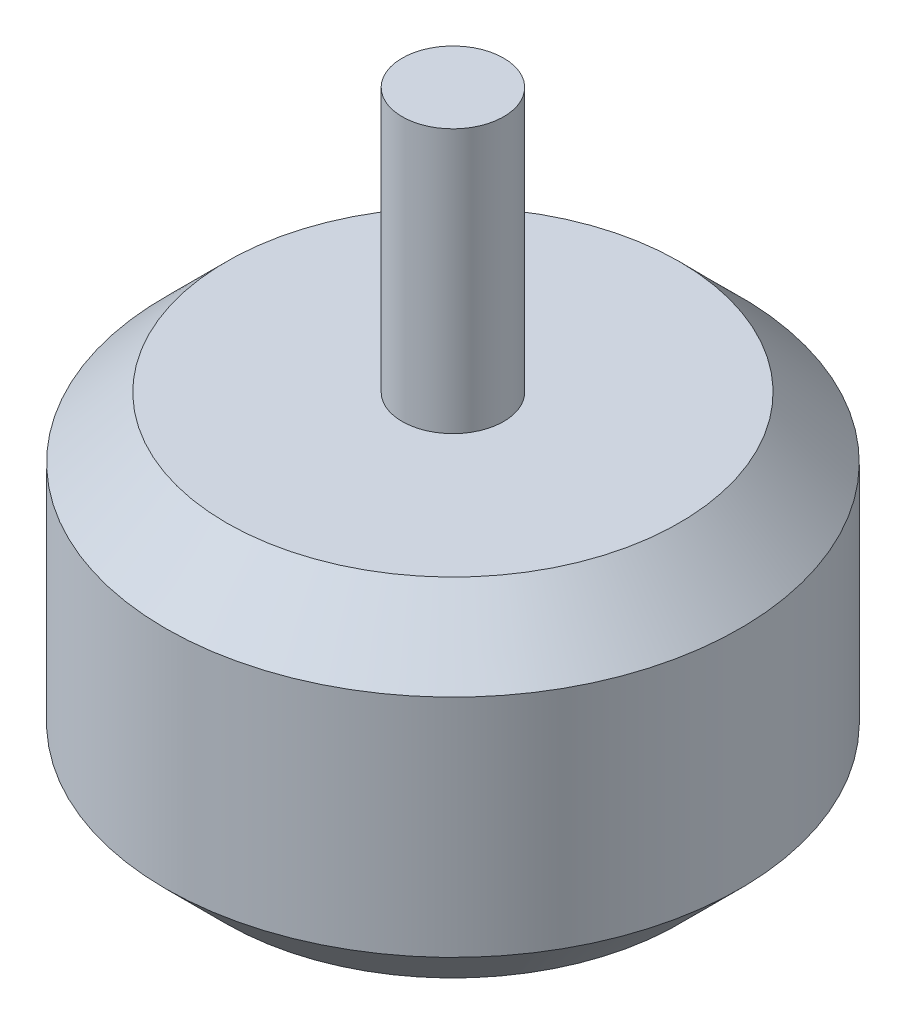
ISO-10303-21;
HEADER;
FILE_DESCRIPTION(('STEP AP214'),'2;1');
FILE_NAME('part.step','',(''),(''),'','','');
FILE_SCHEMA(('AUTOMOTIVE_DESIGN { 1 0 10303 214 1 1 1 1 }'));
ENDSEC;
DATA;
#1=APPLICATION_CONTEXT('core data for automotive mechanical design processes');
#2=APPLICATION_PROTOCOL_DEFINITION('international standard','automotive_design',2000,#1);
#3=PRODUCT_CONTEXT('',#1,'mechanical');
#4=PRODUCT('Part','Part','',(#3));
#5=PRODUCT_RELATED_PRODUCT_CATEGORY('part','',(#4));
#6=PRODUCT_DEFINITION_FORMATION('','',#4);
#7=PRODUCT_DEFINITION_CONTEXT('part definition',#1,'design');
#8=PRODUCT_DEFINITION('design','',#6,#7);
#9=PRODUCT_DEFINITION_SHAPE('','',#8);
#10=(LENGTH_UNIT() NAMED_UNIT(*) SI_UNIT(.MILLI.,.METRE.));
#11=(NAMED_UNIT(*) PLANE_ANGLE_UNIT() SI_UNIT($,.RADIAN.));
#12=(NAMED_UNIT(*) SI_UNIT($,.STERADIAN.) SOLID_ANGLE_UNIT());
#13=UNCERTAINTY_MEASURE_WITH_UNIT(LENGTH_MEASURE(1.E-05),#10,'distance_accuracy_value','');
#14=(GEOMETRIC_REPRESENTATION_CONTEXT(3) GLOBAL_UNCERTAINTY_ASSIGNED_CONTEXT((#13)) GLOBAL_UNIT_ASSIGNED_CONTEXT((#10,
#11,#12)) REPRESENTATION_CONTEXT('',''));
#15=CARTESIAN_POINT('',(0.,0.,0.));
#16=DIRECTION('',(0.,0.,1.));
#17=DIRECTION('',(1.,0.,0.));
#18=AXIS2_PLACEMENT_3D('',#15,#16,#17);
#19=CARTESIAN_POINT('',(0.,17.1,0.));
#20=DIRECTION('',(0.,-1.,0.));
#21=DIRECTION('',(0.,0.,-1.));
#22=AXIS2_PLACEMENT_3D('',#19,#20,#21);
#23=CYLINDRICAL_SURFACE('',#22,14.15);
#24=CARTESIAN_POINT('',(0.,3.00000000000001,0.));
#25=DIRECTION('',(0.,1.,0.));
#26=DIRECTION('',(0.,0.,1.));
#27=AXIS2_PLACEMENT_3D('',#24,#25,#26);
#28=CIRCLE('',#27,14.15);
#29=CARTESIAN_POINT('',(0.,3.00000000000001,14.15));
#30=VERTEX_POINT('',#29);
#31=EDGE_CURVE('E54',#30,#30,#28,.T.);
#32=ORIENTED_EDGE('',*,*,#31,.T.);
#33=EDGE_LOOP('',(#32));
#34=FACE_BOUND('',#33,.T.);
#35=CARTESIAN_POINT('',(0.,14.1,0.));
#36=DIRECTION('',(0.,1.,0.));
#37=DIRECTION('',(0.,0.,1.));
#38=AXIS2_PLACEMENT_3D('',#35,#36,#37);
#39=CIRCLE('',#38,14.15);
#40=CARTESIAN_POINT('',(0.,14.1,14.15));
#41=VERTEX_POINT('',#40);
#42=EDGE_CURVE('E59',#41,#41,#39,.F.);
#43=ORIENTED_EDGE('',*,*,#42,.T.);
#44=EDGE_LOOP('',(#43));
#45=FACE_BOUND('',#44,.T.);
#46=ADVANCED_FACE('F38',(#34,#45),#23,.T.);
#47=CARTESIAN_POINT('',(0.,17.1,0.));
#48=DIRECTION('',(0.,1.,0.));
#49=DIRECTION('',(0.,0.,1.));
#50=AXIS2_PLACEMENT_3D('',#47,#48,#49);
#51=PLANE('',#50);
#52=CARTESIAN_POINT('',(0.,17.1,0.));
#53=DIRECTION('',(0.,1.,0.));
#54=DIRECTION('',(0.,0.,1.));
#55=AXIS2_PLACEMENT_3D('',#52,#53,#54);
#56=CIRCLE('',#55,11.15);
#57=CARTESIAN_POINT('',(0.,17.1,11.15));
#58=VERTEX_POINT('',#57);
#59=EDGE_CURVE('E46',#58,#58,#56,.T.);
#60=ORIENTED_EDGE('',*,*,#59,.T.);
#61=EDGE_LOOP('',(#60));
#62=FACE_BOUND('',#61,.T.);
#63=CARTESIAN_POINT('',(0.,17.1,0.));
#64=DIRECTION('',(0.,1.,0.));
#65=DIRECTION('',(0.,0.,1.));
#66=AXIS2_PLACEMENT_3D('',#63,#64,#65);
#67=CIRCLE('',#66,2.5);
#68=CARTESIAN_POINT('',(0.,17.1,-2.5));
#69=VERTEX_POINT('',#68);
#70=EDGE_CURVE('E62',#69,#69,#67,.T.);
#71=ORIENTED_EDGE('',*,*,#70,.F.);
#72=EDGE_LOOP('',(#71));
#73=FACE_BOUND('',#72,.T.);
#74=ADVANCED_FACE('F111',(#62,#73),#51,.T.);
#75=CARTESIAN_POINT('',(0.,0.,0.));
#76=DIRECTION('',(0.,1.,0.));
#77=DIRECTION('',(0.,0.,1.));
#78=AXIS2_PLACEMENT_3D('',#75,#76,#77);
#79=PLANE('',#78);
#80=CARTESIAN_POINT('',(0.,0.,0.));
#81=DIRECTION('',(0.,1.,0.));
#82=DIRECTION('',(0.,0.,1.));
#83=AXIS2_PLACEMENT_3D('',#80,#81,#82);
#84=CIRCLE('',#83,2.5);
#85=CARTESIAN_POINT('',(0.,0.,2.5));
#86=VERTEX_POINT('',#85);
#87=EDGE_CURVE('E10',#86,#86,#84,.F.);
#88=ORIENTED_EDGE('',*,*,#87,.F.);
#89=EDGE_LOOP('',(#88));
#90=FACE_BOUND('',#89,.T.);
#91=CARTESIAN_POINT('',(-8.00000000000001,0.,0.));
#92=DIRECTION('',(0.,-1.,0.));
#93=DIRECTION('',(0.,0.,-1.));
#94=AXIS2_PLACEMENT_3D('',#91,#92,#93);
#95=CIRCLE('',#94,1.5);
#96=CARTESIAN_POINT('',(-8.00000000000001,0.,-1.5));
#97=VERTEX_POINT('',#96);
#98=EDGE_CURVE('E88',#97,#97,#95,.T.);
#99=ORIENTED_EDGE('',*,*,#98,.F.);
#100=EDGE_LOOP('',(#99));
#101=FACE_BOUND('',#100,.T.);
#102=CARTESIAN_POINT('',(0.,0.,8.00000000000001));
#103=DIRECTION('',(0.,-1.,0.));
#104=DIRECTION('',(0.,0.,-1.));
#105=AXIS2_PLACEMENT_3D('',#102,#103,#104);
#106=CIRCLE('',#105,1.5);
#107=CARTESIAN_POINT('',(0.,0.,6.50000000000001));
#108=VERTEX_POINT('',#107);
#109=EDGE_CURVE('E82',#108,#108,#106,.T.);
#110=ORIENTED_EDGE('',*,*,#109,.F.);
#111=EDGE_LOOP('',(#110));
#112=FACE_BOUND('',#111,.T.);
#113=CARTESIAN_POINT('',(8.00000000000001,0.,0.));
#114=DIRECTION('',(0.,-1.,0.));
#115=DIRECTION('',(0.,0.,1.));
#116=AXIS2_PLACEMENT_3D('',#113,#114,#115);
#117=CIRCLE('',#116,1.5);
#118=CARTESIAN_POINT('',(8.00000000000001,0.,1.5));
#119=VERTEX_POINT('',#118);
#120=EDGE_CURVE('E76',#119,#119,#117,.T.);
#121=ORIENTED_EDGE('',*,*,#120,.F.);
#122=EDGE_LOOP('',(#121));
#123=FACE_BOUND('',#122,.T.);
#124=CARTESIAN_POINT('',(0.,0.,-8.00000000000001));
#125=DIRECTION('',(0.,-1.,0.));
#126=DIRECTION('',(0.,0.,1.));
#127=AXIS2_PLACEMENT_3D('',#124,#125,#126);
#128=CIRCLE('',#127,1.5);
#129=CARTESIAN_POINT('',(0.,0.,-6.50000000000001));
#130=VERTEX_POINT('',#129);
#131=EDGE_CURVE('E69',#130,#130,#128,.T.);
#132=ORIENTED_EDGE('',*,*,#131,.F.);
#133=EDGE_LOOP('',(#132));
#134=FACE_BOUND('',#133,.T.);
#135=CARTESIAN_POINT('',(0.,0.,0.));
#136=DIRECTION('',(0.,1.,0.));
#137=DIRECTION('',(0.,0.,1.));
#138=AXIS2_PLACEMENT_3D('',#135,#136,#137);
#139=CIRCLE('',#138,11.15);
#140=CARTESIAN_POINT('',(0.,0.,11.15));
#141=VERTEX_POINT('',#140);
#142=EDGE_CURVE('E50',#141,#141,#139,.F.);
#143=ORIENTED_EDGE('',*,*,#142,.T.);
#144=EDGE_LOOP('',(#143));
#145=FACE_BOUND('',#144,.T.);
#146=ADVANCED_FACE('F117',(#90,#101,#112,#123,#134,#145),#79,.F.);
#147=CARTESIAN_POINT('',(0.,30.1,0.));
#148=DIRECTION('',(0.,-1.,0.));
#149=DIRECTION('',(0.,0.,-1.));
#150=AXIS2_PLACEMENT_3D('',#147,#148,#149);
#151=CYLINDRICAL_SURFACE('',#150,2.5);
#152=CARTESIAN_POINT('',(0.,30.1,0.));
#153=DIRECTION('',(0.,1.,0.));
#154=DIRECTION('',(0.,0.,1.));
#155=AXIS2_PLACEMENT_3D('',#152,#153,#154);
#156=CIRCLE('',#155,2.5);
#157=CARTESIAN_POINT('',(0.,30.1,-2.5));
#158=VERTEX_POINT('',#157);
#159=EDGE_CURVE('E65',#158,#158,#156,.T.);
#160=CARTESIAN_POINT('',(0.,30.1,-2.5));
#161=CARTESIAN_POINT('',(0.,29.9645833333333,-2.5));
#162=CARTESIAN_POINT('',(0.,29.8291666666667,-2.5));
#163=CARTESIAN_POINT('',(0.,29.5583333333333,-2.5));
#164=CARTESIAN_POINT('',(0.,29.4229166666667,-2.5));
#165=CARTESIAN_POINT('',(0.,29.1520833333333,-2.5));
#166=CARTESIAN_POINT('',(0.,29.0166666666667,-2.5));
#167=CARTESIAN_POINT('',(0.,28.7458333333333,-2.5));
#168=CARTESIAN_POINT('',(0.,28.6104166666667,-2.5));
#169=CARTESIAN_POINT('',(0.,28.3395833333333,-2.5));
#170=CARTESIAN_POINT('',(0.,28.2041666666667,-2.5));
#171=CARTESIAN_POINT('',(0.,27.9333333333333,-2.5));
#172=CARTESIAN_POINT('',(0.,27.7979166666667,-2.5));
#173=CARTESIAN_POINT('',(0.,27.5270833333333,-2.5));
#174=CARTESIAN_POINT('',(0.,27.3916666666667,-2.5));
#175=CARTESIAN_POINT('',(0.,27.1208333333333,-2.5));
#176=CARTESIAN_POINT('',(0.,26.9854166666667,-2.5));
#177=CARTESIAN_POINT('',(0.,26.7145833333333,-2.5));
#178=CARTESIAN_POINT('',(0.,26.5791666666667,-2.5));
#179=CARTESIAN_POINT('',(0.,26.3083333333333,-2.5));
#180=CARTESIAN_POINT('',(0.,26.1729166666667,-2.5));
#181=CARTESIAN_POINT('',(0.,25.9020833333333,-2.5));
#182=CARTESIAN_POINT('',(0.,25.7666666666667,-2.5));
#183=CARTESIAN_POINT('',(0.,25.4958333333333,-2.5));
#184=CARTESIAN_POINT('',(0.,25.3604166666667,-2.5));
#185=CARTESIAN_POINT('',(0.,25.0895833333333,-2.5));
#186=CARTESIAN_POINT('',(0.,24.9541666666667,-2.5));
#187=CARTESIAN_POINT('',(0.,24.6833333333333,-2.5));
#188=CARTESIAN_POINT('',(0.,24.5479166666667,-2.5));
#189=CARTESIAN_POINT('',(0.,24.2770833333333,-2.5));
#190=CARTESIAN_POINT('',(0.,24.1416666666667,-2.5));
#191=CARTESIAN_POINT('',(0.,23.8708333333333,-2.5));
#192=CARTESIAN_POINT('',(0.,23.7354166666667,-2.5));
#193=CARTESIAN_POINT('',(0.,23.4645833333333,-2.5));
#194=CARTESIAN_POINT('',(0.,23.3291666666667,-2.5));
#195=CARTESIAN_POINT('',(0.,23.0583333333333,-2.5));
#196=CARTESIAN_POINT('',(0.,22.9229166666667,-2.5));
#197=CARTESIAN_POINT('',(0.,22.6520833333333,-2.5));
#198=CARTESIAN_POINT('',(0.,22.5166666666667,-2.5));
#199=CARTESIAN_POINT('',(0.,22.2458333333333,-2.5));
#200=CARTESIAN_POINT('',(0.,22.1104166666667,-2.5));
#201=CARTESIAN_POINT('',(0.,21.8395833333333,-2.5));
#202=CARTESIAN_POINT('',(0.,21.7041666666667,-2.5));
#203=CARTESIAN_POINT('',(0.,21.4333333333333,-2.5));
#204=CARTESIAN_POINT('',(0.,21.2979166666667,-2.5));
#205=CARTESIAN_POINT('',(0.,21.0270833333333,-2.5));
#206=CARTESIAN_POINT('',(0.,20.8916666666667,-2.5));
#207=CARTESIAN_POINT('',(0.,20.6208333333333,-2.5));
#208=CARTESIAN_POINT('',(0.,20.4854166666667,-2.5));
#209=CARTESIAN_POINT('',(0.,20.2145833333333,-2.5));
#210=CARTESIAN_POINT('',(0.,20.0791666666667,-2.5));
#211=CARTESIAN_POINT('',(0.,19.8083333333333,-2.5));
#212=CARTESIAN_POINT('',(0.,19.6729166666667,-2.5));
#213=CARTESIAN_POINT('',(0.,19.4020833333333,-2.5));
#214=CARTESIAN_POINT('',(0.,19.2666666666667,-2.5));
#215=CARTESIAN_POINT('',(0.,18.9958333333333,-2.5));
#216=CARTESIAN_POINT('',(0.,18.8604166666667,-2.5));
#217=CARTESIAN_POINT('',(0.,18.5895833333333,-2.5));
#218=CARTESIAN_POINT('',(0.,18.4541666666667,-2.5));
#219=CARTESIAN_POINT('',(0.,18.1833333333333,-2.5));
#220=CARTESIAN_POINT('',(0.,18.0479166666667,-2.5));
#221=CARTESIAN_POINT('',(0.,17.7770833333333,-2.5));
#222=CARTESIAN_POINT('',(0.,17.6416666666667,-2.5));
#223=CARTESIAN_POINT('',(0.,17.3708333333333,-2.5));
#224=CARTESIAN_POINT('',(0.,17.2354166666667,-2.5));
#225=CARTESIAN_POINT('',(0.,17.1,-2.5));
#226=B_SPLINE_CURVE_WITH_KNOTS('',3,(#160,#161,#162,#163,#164,#165,#166,#167,#168,#169,#170,
#171,#172,#173,#174,#175,#176,#177,#178,#179,#180,#181,#182,#183,#184,#185,#186,#187,#188,#189,
#190,#191,#192,#193,#194,#195,#196,#197,#198,#199,#200,#201,#202,#203,#204,#205,#206,#207,#208,
#209,#210,#211,#212,#213,#214,#215,#216,#217,#218,#219,#220,#221,#222,#223,#224,#225),
.UNSPECIFIED.,.F.,.F.,(4,2,2,2,2,2,2,2,2,2,2,2,2,2,2,2,2,2,2,2,2,2,2,2,2,2,2,2,2,2,2,2,4),(0.,
0.406249999999997,0.812499999999997,1.21875,1.625,2.03125,2.4375,2.84375,3.25,3.65625,4.0625,
4.46875,4.875,5.28125,5.6875,6.09375,6.5,6.90625,7.3125,7.71875,8.125,8.53125,8.9375,9.34375,
9.75,10.15625,10.5625,10.96875,11.375,11.78125,12.1875,12.59375,13.),.UNSPECIFIED.);
#227=EDGE_CURVE('BSEAM134',#158,#69,#226,.T.);
#228=ORIENTED_EDGE('',*,*,#159,.F.);
#229=ORIENTED_EDGE('',*,*,#70,.T.);
#230=ORIENTED_EDGE('',*,*,#227,.T.);
#231=ORIENTED_EDGE('',*,*,#227,.F.);
#232=EDGE_LOOP('',(#228,#230,#229,#231));
#233=FACE_BOUND('',#232,.T.);
#234=ADVANCED_FACE('F134',(#233),#151,.T.);
#235=CARTESIAN_POINT('',(0.,30.1,0.));
#236=DIRECTION('',(0.,1.,0.));
#237=DIRECTION('',(0.,0.,1.));
#238=AXIS2_PLACEMENT_3D('',#235,#236,#237);
#239=PLANE('',#238);
#240=ORIENTED_EDGE('',*,*,#159,.T.);
#241=EDGE_LOOP('',(#240));
#242=FACE_BOUND('',#241,.T.);
#243=ADVANCED_FACE('F126',(#242),#239,.T.);
#244=CARTESIAN_POINT('',(0.,3.00000000000001,0.));
#245=DIRECTION('',(0.,1.,0.));
#246=DIRECTION('',(0.,0.,1.));
#247=AXIS2_PLACEMENT_3D('',#244,#245,#246);
#248=CONICAL_SURFACE('',#247,14.15,0.785398163397449);
#249=ORIENTED_EDGE('',*,*,#142,.F.);
#250=EDGE_LOOP('',(#249));
#251=FACE_BOUND('',#250,.T.);
#252=ORIENTED_EDGE('',*,*,#31,.F.);
#253=EDGE_LOOP('',(#252));
#254=FACE_BOUND('',#253,.T.);
#255=ADVANCED_FACE('F122',(#251,#254),#248,.T.);
#256=CARTESIAN_POINT('',(0.,17.1,0.));
#257=DIRECTION('',(0.,-1.,0.));
#258=DIRECTION('',(0.,0.,-1.));
#259=AXIS2_PLACEMENT_3D('',#256,#257,#258);
#260=CONICAL_SURFACE('',#259,11.15,0.785398163397447);
#261=ORIENTED_EDGE('',*,*,#42,.F.);
#262=EDGE_LOOP('',(#261));
#263=FACE_BOUND('',#262,.T.);
#264=ORIENTED_EDGE('',*,*,#59,.F.);
#265=EDGE_LOOP('',(#264));
#266=FACE_BOUND('',#265,.T.);
#267=ADVANCED_FACE('F41',(#263,#266),#260,.T.);
#268=CARTESIAN_POINT('',(0.,4.,-8.00000000000001));
#269=DIRECTION('',(0.,-1.,0.));
#270=DIRECTION('',(0.,0.,-1.));
#271=AXIS2_PLACEMENT_3D('',#268,#269,#270);
#272=CYLINDRICAL_SURFACE('',#271,1.5);
#273=CARTESIAN_POINT('',(0.,4.,-8.00000000000001));
#274=DIRECTION('',(0.,-1.,0.));
#275=DIRECTION('',(0.,0.,1.));
#276=AXIS2_PLACEMENT_3D('',#273,#274,#275);
#277=CIRCLE('',#276,1.5);
#278=CARTESIAN_POINT('',(0.,4.,-6.50000000000001));
#279=VERTEX_POINT('',#278);
#280=EDGE_CURVE('E72',#279,#279,#277,.T.);
#281=ORIENTED_EDGE('',*,*,#280,.F.);
#282=EDGE_LOOP('',(#281));
#283=FACE_BOUND('',#282,.T.);
#284=ORIENTED_EDGE('',*,*,#131,.T.);
#285=EDGE_LOOP('',(#284));
#286=FACE_BOUND('',#285,.T.);
#287=ADVANCED_FACE('F132',(#283,#286),#272,.F.);
#288=CARTESIAN_POINT('',(0.,4.,-8.00000000000001));
#289=DIRECTION('',(0.,1.,0.));
#290=DIRECTION('',(0.,0.,1.));
#291=AXIS2_PLACEMENT_3D('',#288,#289,#290);
#292=PLANE('',#291);
#293=ORIENTED_EDGE('',*,*,#280,.T.);
#294=EDGE_LOOP('',(#293));
#295=FACE_BOUND('',#294,.T.);
#296=ADVANCED_FACE('F158',(#295),#292,.F.);
#297=CARTESIAN_POINT('',(8.00000000000001,4.,0.));
#298=DIRECTION('',(0.,-1.,0.));
#299=DIRECTION('',(0.,0.,-1.));
#300=AXIS2_PLACEMENT_3D('',#297,#298,#299);
#301=CYLINDRICAL_SURFACE('',#300,1.5);
#302=CARTESIAN_POINT('',(8.00000000000001,4.,0.));
#303=DIRECTION('',(0.,-1.,0.));
#304=DIRECTION('',(0.,0.,1.));
#305=AXIS2_PLACEMENT_3D('',#302,#303,#304);
#306=CIRCLE('',#305,1.5);
#307=CARTESIAN_POINT('',(8.00000000000001,4.,1.5));
#308=VERTEX_POINT('',#307);
#309=EDGE_CURVE('E79',#308,#308,#306,.T.);
#310=ORIENTED_EDGE('',*,*,#309,.F.);
#311=EDGE_LOOP('',(#310));
#312=FACE_BOUND('',#311,.T.);
#313=ORIENTED_EDGE('',*,*,#120,.T.);
#314=EDGE_LOOP('',(#313));
#315=FACE_BOUND('',#314,.T.);
#316=ADVANCED_FACE('F164',(#312,#315),#301,.F.);
#317=CARTESIAN_POINT('',(8.00000000000001,4.,0.));
#318=DIRECTION('',(0.,1.,0.));
#319=DIRECTION('',(0.,0.,1.));
#320=AXIS2_PLACEMENT_3D('',#317,#318,#319);
#321=PLANE('',#320);
#322=ORIENTED_EDGE('',*,*,#309,.T.);
#323=EDGE_LOOP('',(#322));
#324=FACE_BOUND('',#323,.T.);
#325=ADVANCED_FACE('F171',(#324),#321,.F.);
#326=CARTESIAN_POINT('',(0.,4.,8.00000000000001));
#327=DIRECTION('',(0.,-1.,0.));
#328=DIRECTION('',(0.,0.,-1.));
#329=AXIS2_PLACEMENT_3D('',#326,#327,#328);
#330=CYLINDRICAL_SURFACE('',#329,1.5);
#331=CARTESIAN_POINT('',(0.,4.,8.00000000000001));
#332=DIRECTION('',(0.,-1.,0.));
#333=DIRECTION('',(0.,0.,-1.));
#334=AXIS2_PLACEMENT_3D('',#331,#332,#333);
#335=CIRCLE('',#334,1.5);
#336=CARTESIAN_POINT('',(0.,4.,6.50000000000001));
#337=VERTEX_POINT('',#336);
#338=EDGE_CURVE('E85',#337,#337,#335,.T.);
#339=ORIENTED_EDGE('',*,*,#338,.F.);
#340=EDGE_LOOP('',(#339));
#341=FACE_BOUND('',#340,.T.);
#342=ORIENTED_EDGE('',*,*,#109,.T.);
#343=EDGE_LOOP('',(#342));
#344=FACE_BOUND('',#343,.T.);
#345=ADVANCED_FACE('F175',(#341,#344),#330,.F.);
#346=CARTESIAN_POINT('',(0.,4.,8.00000000000001));
#347=DIRECTION('',(0.,-1.,0.));
#348=DIRECTION('',(0.,0.,-1.));
#349=AXIS2_PLACEMENT_3D('',#346,#347,#348);
#350=PLANE('',#349);
#351=ORIENTED_EDGE('',*,*,#338,.T.);
#352=EDGE_LOOP('',(#351));
#353=FACE_BOUND('',#352,.T.);
#354=ADVANCED_FACE('F179',(#353),#350,.T.);
#355=CARTESIAN_POINT('',(-8.00000000000001,4.,0.));
#356=DIRECTION('',(0.,-1.,0.));
#357=DIRECTION('',(0.,0.,-1.));
#358=AXIS2_PLACEMENT_3D('',#355,#356,#357);
#359=CYLINDRICAL_SURFACE('',#358,1.5);
#360=CARTESIAN_POINT('',(-8.00000000000001,4.,0.));
#361=DIRECTION('',(0.,-1.,0.));
#362=DIRECTION('',(0.,0.,-1.));
#363=AXIS2_PLACEMENT_3D('',#360,#361,#362);
#364=CIRCLE('',#363,1.5);
#365=CARTESIAN_POINT('',(-8.00000000000001,4.,-1.5));
#366=VERTEX_POINT('',#365);
#367=EDGE_CURVE('E68',#366,#366,#364,.T.);
#368=ORIENTED_EDGE('',*,*,#367,.F.);
#369=EDGE_LOOP('',(#368));
#370=FACE_BOUND('',#369,.T.);
#371=ORIENTED_EDGE('',*,*,#98,.T.);
#372=EDGE_LOOP('',(#371));
#373=FACE_BOUND('',#372,.T.);
#374=ADVANCED_FACE('F107',(#370,#373),#359,.F.);
#375=CARTESIAN_POINT('',(-8.00000000000001,4.,0.));
#376=DIRECTION('',(0.,-1.,0.));
#377=DIRECTION('',(0.,0.,-1.));
#378=AXIS2_PLACEMENT_3D('',#375,#376,#377);
#379=PLANE('',#378);
#380=ORIENTED_EDGE('',*,*,#367,.T.);
#381=EDGE_LOOP('',(#380));
#382=FACE_BOUND('',#381,.T.);
#383=ADVANCED_FACE('F100',(#382),#379,.T.);
#384=CARTESIAN_POINT('',(0.,-2.,0.));
#385=DIRECTION('',(0.,1.,0.));
#386=DIRECTION('',(0.,0.,1.));
#387=AXIS2_PLACEMENT_3D('',#384,#385,#386);
#388=CYLINDRICAL_SURFACE('',#387,2.5);
#389=CARTESIAN_POINT('',(0.,-2.,0.));
#390=DIRECTION('',(0.,-1.,0.));
#391=DIRECTION('',(0.,0.,-1.));
#392=AXIS2_PLACEMENT_3D('',#389,#390,#391);
#393=CIRCLE('',#392,2.5);
#394=CARTESIAN_POINT('',(0.,-2.,-2.5));
#395=VERTEX_POINT('',#394);
#396=EDGE_CURVE('E73',#395,#395,#393,.T.);
#397=ORIENTED_EDGE('',*,*,#396,.F.);
#398=EDGE_LOOP('',(#397));
#399=FACE_BOUND('',#398,.T.);
#400=ORIENTED_EDGE('',*,*,#87,.T.);
#401=EDGE_LOOP('',(#400));
#402=FACE_BOUND('',#401,.T.);
#403=ADVANCED_FACE('F98',(#399,#402),#388,.T.);
#404=CARTESIAN_POINT('',(0.,-2.,0.));
#405=DIRECTION('',(0.,-1.,0.));
#406=DIRECTION('',(0.,0.,-1.));
#407=AXIS2_PLACEMENT_3D('',#404,#405,#406);
#408=PLANE('',#407);
#409=ORIENTED_EDGE('',*,*,#396,.T.);
#410=EDGE_LOOP('',(#409));
#411=FACE_BOUND('',#410,.T.);
#412=ADVANCED_FACE('F96',(#411),#408,.T.);
#413=CLOSED_SHELL('',(#46,#74,#146,#234,#243,#255,#267,#287,#296,#316,#325,#345,#354,#374,#383,
#403,#412));
#414=MANIFOLD_SOLID_BREP('B2',#413);
#415=ADVANCED_BREP_SHAPE_REPRESENTATION('',(#18,#414),#14);
#416=SHAPE_DEFINITION_REPRESENTATION(#9,#415);
ENDSEC;
END-ISO-10303-21;
